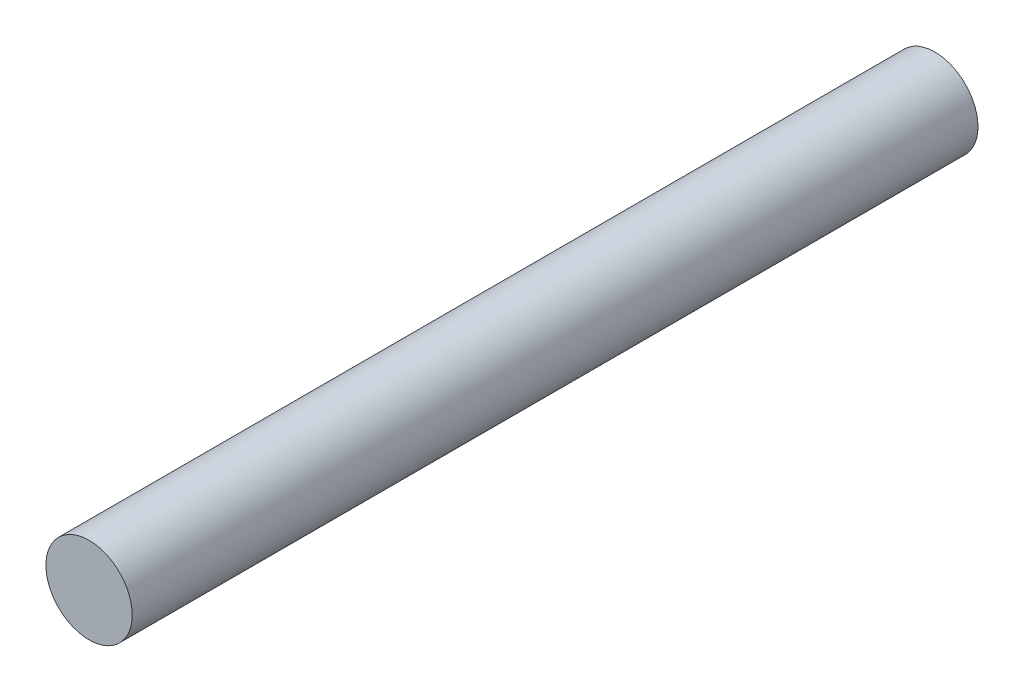
ISO-10303-21;
HEADER;
FILE_DESCRIPTION(('STEP AP214'),'2;1');
FILE_NAME('part.step','',(''),(''),'','','');
FILE_SCHEMA(('AUTOMOTIVE_DESIGN { 1 0 10303 214 1 1 1 1 }'));
ENDSEC;
DATA;
#1=APPLICATION_CONTEXT('core data for automotive mechanical design processes');
#2=APPLICATION_PROTOCOL_DEFINITION('international standard','automotive_design',2000,#1);
#3=PRODUCT_CONTEXT('',#1,'mechanical');
#4=PRODUCT('Part','Part','',(#3));
#5=PRODUCT_RELATED_PRODUCT_CATEGORY('part','',(#4));
#6=PRODUCT_DEFINITION_FORMATION('','',#4);
#7=PRODUCT_DEFINITION_CONTEXT('part definition',#1,'design');
#8=PRODUCT_DEFINITION('design','',#6,#7);
#9=PRODUCT_DEFINITION_SHAPE('','',#8);
#10=(LENGTH_UNIT() NAMED_UNIT(*) SI_UNIT(.MILLI.,.METRE.));
#11=(NAMED_UNIT(*) PLANE_ANGLE_UNIT() SI_UNIT($,.RADIAN.));
#12=(NAMED_UNIT(*) SI_UNIT($,.STERADIAN.) SOLID_ANGLE_UNIT());
#13=UNCERTAINTY_MEASURE_WITH_UNIT(LENGTH_MEASURE(1.E-05),#10,'distance_accuracy_value','');
#14=(GEOMETRIC_REPRESENTATION_CONTEXT(3) GLOBAL_UNCERTAINTY_ASSIGNED_CONTEXT((#13)) GLOBAL_UNIT_ASSIGNED_CONTEXT((#10,
#11,#12)) REPRESENTATION_CONTEXT('',''));
#15=CARTESIAN_POINT('',(0.,0.,0.));
#16=DIRECTION('',(0.,0.,1.));
#17=DIRECTION('',(1.,0.,0.));
#18=AXIS2_PLACEMENT_3D('',#15,#16,#17);
#19=CARTESIAN_POINT('',(60.486,0.61,-25.2));
#20=DIRECTION('',(0.,0.,1.));
#21=DIRECTION('',(1.,0.,0.));
#22=AXIS2_PLACEMENT_3D('',#19,#20,#21);
#23=PLANE('',#22);
#24=CARTESIAN_POINT('',(60.486,0.61,-25.2));
#25=DIRECTION('',(0.,0.,1.));
#26=DIRECTION('',(1.,0.,0.));
#27=AXIS2_PLACEMENT_3D('',#24,#25,#26);
#28=CIRCLE('',#27,0.306);
#29=CARTESIAN_POINT('',(60.792,0.61,-25.2));
#30=VERTEX_POINT('',#29);
#31=EDGE_CURVE('E17',#30,#30,#28,.F.);
#32=ORIENTED_EDGE('',*,*,#31,.F.);
#33=EDGE_LOOP('',(#32));
#34=FACE_BOUND('',#33,.T.);
#35=ADVANCED_FACE('F14',(#34),#23,.T.);
#36=CARTESIAN_POINT('',(60.486,0.61,-31.2));
#37=DIRECTION('',(0.,0.,-1.));
#38=DIRECTION('',(-1.,0.,0.));
#39=AXIS2_PLACEMENT_3D('',#36,#37,#38);
#40=PLANE('',#39);
#41=CARTESIAN_POINT('',(60.486,0.61,-31.2));
#42=DIRECTION('',(0.,0.,1.));
#43=DIRECTION('',(1.,0.,0.));
#44=AXIS2_PLACEMENT_3D('',#41,#42,#43);
#45=CIRCLE('',#44,0.306);
#46=CARTESIAN_POINT('',(60.792,0.61,-31.2));
#47=VERTEX_POINT('',#46);
#48=EDGE_CURVE('E10',#47,#47,#45,.T.);
#49=ORIENTED_EDGE('',*,*,#48,.F.);
#50=EDGE_LOOP('',(#49));
#51=FACE_BOUND('',#50,.T.);
#52=ADVANCED_FACE('F29',(#51),#40,.T.);
#53=CARTESIAN_POINT('',(60.486,0.61,-28.2));
#54=DIRECTION('',(0.,0.,1.));
#55=DIRECTION('',(1.,0.,0.));
#56=AXIS2_PLACEMENT_3D('',#53,#54,#55);
#57=CYLINDRICAL_SURFACE('',#56,0.306);
#58=ORIENTED_EDGE('',*,*,#31,.T.);
#59=EDGE_LOOP('',(#58));
#60=FACE_BOUND('',#59,.T.);
#61=ORIENTED_EDGE('',*,*,#48,.T.);
#62=EDGE_LOOP('',(#61));
#63=FACE_BOUND('',#62,.T.);
#64=ADVANCED_FACE('F26',(#60,#63),#57,.T.);
#65=CLOSED_SHELL('',(#35,#52,#64));
#66=MANIFOLD_SOLID_BREP('B1',#65);
#67=ADVANCED_BREP_SHAPE_REPRESENTATION('',(#18,#66),#14);
#68=SHAPE_DEFINITION_REPRESENTATION(#9,#67);
ENDSEC;
END-ISO-10303-21;
